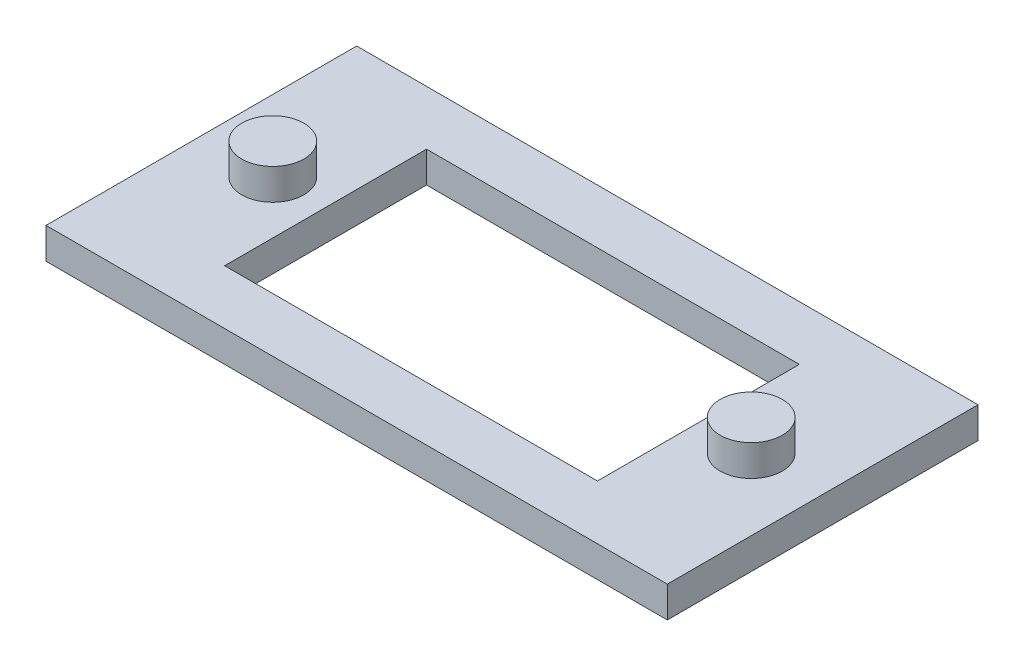
ISO-10303-21;
HEADER;
FILE_DESCRIPTION(('STEP AP214'),'2;1');
FILE_NAME('part.step','',(''),(''),'','','');
FILE_SCHEMA(('AUTOMOTIVE_DESIGN { 1 0 10303 214 1 1 1 1 }'));
ENDSEC;
DATA;
#1=APPLICATION_CONTEXT('core data for automotive mechanical design processes');
#2=APPLICATION_PROTOCOL_DEFINITION('international standard','automotive_design',2000,#1);
#3=PRODUCT_CONTEXT('',#1,'mechanical');
#4=PRODUCT('Part','Part','',(#3));
#5=PRODUCT_RELATED_PRODUCT_CATEGORY('part','',(#4));
#6=PRODUCT_DEFINITION_FORMATION('','',#4);
#7=PRODUCT_DEFINITION_CONTEXT('part definition',#1,'design');
#8=PRODUCT_DEFINITION('design','',#6,#7);
#9=PRODUCT_DEFINITION_SHAPE('','',#8);
#10=(LENGTH_UNIT() NAMED_UNIT(*) SI_UNIT(.MILLI.,.METRE.));
#11=(NAMED_UNIT(*) PLANE_ANGLE_UNIT() SI_UNIT($,.RADIAN.));
#12=(NAMED_UNIT(*) SI_UNIT($,.STERADIAN.) SOLID_ANGLE_UNIT());
#13=UNCERTAINTY_MEASURE_WITH_UNIT(LENGTH_MEASURE(1.E-05),#10,'distance_accuracy_value','');
#14=(GEOMETRIC_REPRESENTATION_CONTEXT(3) GLOBAL_UNCERTAINTY_ASSIGNED_CONTEXT((#13)) GLOBAL_UNIT_ASSIGNED_CONTEXT((#10,
#11,#12)) REPRESENTATION_CONTEXT('',''));
#15=CARTESIAN_POINT('',(0.,0.,0.));
#16=DIRECTION('',(0.,0.,1.));
#17=DIRECTION('',(1.,0.,0.));
#18=AXIS2_PLACEMENT_3D('',#15,#16,#17);
#19=CARTESIAN_POINT('',(10.,1.,5.));
#20=DIRECTION('',(-1.,0.,0.));
#21=DIRECTION('',(0.,0.,1.));
#22=AXIS2_PLACEMENT_3D('',#19,#20,#21);
#23=PLANE('',#22);
#24=DIRECTION('',(0.,0.,-1.));
#25=VECTOR('',#24,1.);
#26=CARTESIAN_POINT('',(10.,0.,5.));
#27=LINE('',#26,#25);
#28=CARTESIAN_POINT('',(10.,0.,5.));
#29=VERTEX_POINT('',#28);
#30=CARTESIAN_POINT('',(10.,0.,-5.));
#31=VERTEX_POINT('',#30);
#32=EDGE_CURVE('E123',#29,#31,#27,.T.);
#33=ORIENTED_EDGE('',*,*,#32,.T.);
#34=DIRECTION('',(0.,-1.,0.));
#35=VECTOR('',#34,1.);
#36=CARTESIAN_POINT('',(10.,1.,-5.));
#37=LINE('',#36,#35);
#38=CARTESIAN_POINT('',(10.,1.,-5.));
#39=VERTEX_POINT('',#38);
#40=EDGE_CURVE('E152',#39,#31,#37,.T.);
#41=ORIENTED_EDGE('',*,*,#40,.F.);
#42=DIRECTION('',(0.,0.,-1.));
#43=VECTOR('',#42,1.);
#44=CARTESIAN_POINT('',(10.,1.,5.));
#45=LINE('',#44,#43);
#46=CARTESIAN_POINT('',(10.,1.,5.));
#47=VERTEX_POINT('',#46);
#48=EDGE_CURVE('E126',#47,#39,#45,.T.);
#49=ORIENTED_EDGE('',*,*,#48,.F.);
#50=DIRECTION('',(0.,-1.,0.));
#51=VECTOR('',#50,1.);
#52=CARTESIAN_POINT('',(10.,1.,5.));
#53=LINE('',#52,#51);
#54=EDGE_CURVE('E136',#47,#29,#53,.T.);
#55=ORIENTED_EDGE('',*,*,#54,.T.);
#56=EDGE_LOOP('',(#33,#41,#49,#55));
#57=FACE_BOUND('',#56,.T.);
#58=ADVANCED_FACE('F33',(#57),#23,.F.);
#59=CARTESIAN_POINT('',(-10.,1.,-5.));
#60=DIRECTION('',(0.,0.,1.));
#61=DIRECTION('',(1.,0.,0.));
#62=AXIS2_PLACEMENT_3D('',#59,#60,#61);
#63=PLANE('',#62);
#64=DIRECTION('',(-1.,0.,0.));
#65=VECTOR('',#64,1.);
#66=CARTESIAN_POINT('',(-10.,0.,-5.));
#67=LINE('',#66,#65);
#68=CARTESIAN_POINT('',(-10.,0.,-5.));
#69=VERTEX_POINT('',#68);
#70=EDGE_CURVE('E139',#31,#69,#67,.T.);
#71=ORIENTED_EDGE('',*,*,#70,.T.);
#72=DIRECTION('',(0.,-1.,0.));
#73=VECTOR('',#72,1.);
#74=CARTESIAN_POINT('',(-10.,1.,-5.));
#75=LINE('',#74,#73);
#76=CARTESIAN_POINT('',(-10.,1.,-5.));
#77=VERTEX_POINT('',#76);
#78=EDGE_CURVE('E149',#77,#69,#75,.T.);
#79=ORIENTED_EDGE('',*,*,#78,.F.);
#80=DIRECTION('',(-1.,0.,0.));
#81=VECTOR('',#80,1.);
#82=CARTESIAN_POINT('',(-10.,1.,-5.));
#83=LINE('',#82,#81);
#84=EDGE_CURVE('E129',#39,#77,#83,.T.);
#85=ORIENTED_EDGE('',*,*,#84,.F.);
#86=ORIENTED_EDGE('',*,*,#40,.T.);
#87=EDGE_LOOP('',(#71,#79,#85,#86));
#88=FACE_BOUND('',#87,.T.);
#89=ADVANCED_FACE('F184',(#88),#63,.F.);
#90=CARTESIAN_POINT('',(-10.,1.,5.));
#91=DIRECTION('',(1.,0.,0.));
#92=DIRECTION('',(0.,0.,-1.));
#93=AXIS2_PLACEMENT_3D('',#90,#91,#92);
#94=PLANE('',#93);
#95=DIRECTION('',(0.,0.,1.));
#96=VECTOR('',#95,1.);
#97=CARTESIAN_POINT('',(-10.,0.,5.));
#98=LINE('',#97,#96);
#99=CARTESIAN_POINT('',(-10.,0.,5.));
#100=VERTEX_POINT('',#99);
#101=EDGE_CURVE('E141',#69,#100,#98,.T.);
#102=ORIENTED_EDGE('',*,*,#101,.T.);
#103=DIRECTION('',(0.,-1.,0.));
#104=VECTOR('',#103,1.);
#105=CARTESIAN_POINT('',(-10.,1.,5.));
#106=LINE('',#105,#104);
#107=CARTESIAN_POINT('',(-10.,1.,5.));
#108=VERTEX_POINT('',#107);
#109=EDGE_CURVE('E146',#108,#100,#106,.T.);
#110=ORIENTED_EDGE('',*,*,#109,.F.);
#111=DIRECTION('',(0.,0.,1.));
#112=VECTOR('',#111,1.);
#113=CARTESIAN_POINT('',(-10.,1.,5.));
#114=LINE('',#113,#112);
#115=EDGE_CURVE('E132',#77,#108,#114,.T.);
#116=ORIENTED_EDGE('',*,*,#115,.F.);
#117=ORIENTED_EDGE('',*,*,#78,.T.);
#118=EDGE_LOOP('',(#102,#110,#116,#117));
#119=FACE_BOUND('',#118,.T.);
#120=ADVANCED_FACE('F178',(#119),#94,.F.);
#121=CARTESIAN_POINT('',(-10.,1.,5.));
#122=DIRECTION('',(0.,0.,-1.));
#123=DIRECTION('',(-1.,0.,0.));
#124=AXIS2_PLACEMENT_3D('',#121,#122,#123);
#125=PLANE('',#124);
#126=DIRECTION('',(1.,0.,0.));
#127=VECTOR('',#126,1.);
#128=CARTESIAN_POINT('',(-10.,0.,5.));
#129=LINE('',#128,#127);
#130=EDGE_CURVE('E130',#100,#29,#129,.T.);
#131=ORIENTED_EDGE('',*,*,#130,.T.);
#132=ORIENTED_EDGE('',*,*,#54,.F.);
#133=DIRECTION('',(1.,0.,0.));
#134=VECTOR('',#133,1.);
#135=CARTESIAN_POINT('',(-10.,1.,5.));
#136=LINE('',#135,#134);
#137=EDGE_CURVE('E134',#108,#47,#136,.T.);
#138=ORIENTED_EDGE('',*,*,#137,.F.);
#139=ORIENTED_EDGE('',*,*,#109,.T.);
#140=EDGE_LOOP('',(#131,#132,#138,#139));
#141=FACE_BOUND('',#140,.T.);
#142=ADVANCED_FACE('F168',(#141),#125,.F.);
#143=CARTESIAN_POINT('',(0.,1.,0.));
#144=DIRECTION('',(0.,-1.,0.));
#145=DIRECTION('',(0.,0.,-1.));
#146=AXIS2_PLACEMENT_3D('',#143,#144,#145);
#147=PLANE('',#146);
#148=CARTESIAN_POINT('',(7.7,1.,0.));
#149=DIRECTION('',(0.,-1.,0.));
#150=DIRECTION('',(0.,0.,-1.));
#151=AXIS2_PLACEMENT_3D('',#148,#149,#150);
#152=CIRCLE('',#151,1.);
#153=CARTESIAN_POINT('',(7.7,1.,-1.));
#154=VERTEX_POINT('',#153);
#155=EDGE_CURVE('E11',#154,#154,#152,.F.);
#156=ORIENTED_EDGE('',*,*,#155,.F.);
#157=EDGE_LOOP('',(#156));
#158=FACE_BOUND('',#157,.T.);
#159=CARTESIAN_POINT('',(-7.7,1.,0.));
#160=DIRECTION('',(0.,-1.,0.));
#161=DIRECTION('',(0.,0.,-1.));
#162=AXIS2_PLACEMENT_3D('',#159,#160,#161);
#163=CIRCLE('',#162,1.);
#164=CARTESIAN_POINT('',(-7.7,1.,-1.));
#165=VERTEX_POINT('',#164);
#166=EDGE_CURVE('E40',#165,#165,#163,.F.);
#167=ORIENTED_EDGE('',*,*,#166,.F.);
#168=EDGE_LOOP('',(#167));
#169=FACE_BOUND('',#168,.T.);
#170=DIRECTION('',(-1.,0.,0.));
#171=VECTOR('',#170,1.);
#172=CARTESIAN_POINT('',(-6.,1.,-3.25));
#173=LINE('',#172,#171);
#174=CARTESIAN_POINT('',(6.,1.,-3.25));
#175=VERTEX_POINT('',#174);
#176=CARTESIAN_POINT('',(-6.,1.,-3.25));
#177=VERTEX_POINT('',#176);
#178=EDGE_CURVE('E109',#175,#177,#173,.T.);
#179=ORIENTED_EDGE('',*,*,#178,.F.);
#180=DIRECTION('',(0.,0.,-1.));
#181=VECTOR('',#180,1.);
#182=CARTESIAN_POINT('',(6.,1.,3.25));
#183=LINE('',#182,#181);
#184=CARTESIAN_POINT('',(6.,1.,3.25));
#185=VERTEX_POINT('',#184);
#186=EDGE_CURVE('E47',#185,#175,#183,.T.);
#187=ORIENTED_EDGE('',*,*,#186,.F.);
#188=DIRECTION('',(1.,0.,0.));
#189=VECTOR('',#188,1.);
#190=CARTESIAN_POINT('',(-6.,1.,3.25));
#191=LINE('',#190,#189);
#192=CARTESIAN_POINT('',(-6.,1.,3.25));
#193=VERTEX_POINT('',#192);
#194=EDGE_CURVE('E116',#193,#185,#191,.T.);
#195=ORIENTED_EDGE('',*,*,#194,.F.);
#196=DIRECTION('',(0.,0.,1.));
#197=VECTOR('',#196,1.);
#198=CARTESIAN_POINT('',(-6.,1.,3.25));
#199=LINE('',#198,#197);
#200=EDGE_CURVE('E100',#177,#193,#199,.T.);
#201=ORIENTED_EDGE('',*,*,#200,.F.);
#202=EDGE_LOOP('',(#179,#187,#195,#201));
#203=FACE_BOUND('',#202,.T.);
#204=ORIENTED_EDGE('',*,*,#48,.T.);
#205=ORIENTED_EDGE('',*,*,#84,.T.);
#206=ORIENTED_EDGE('',*,*,#115,.T.);
#207=ORIENTED_EDGE('',*,*,#137,.T.);
#208=EDGE_LOOP('',(#204,#205,#206,#207));
#209=FACE_BOUND('',#208,.T.);
#210=ADVANCED_FACE('F113',(#158,#169,#203,#209),#147,.F.);
#211=CARTESIAN_POINT('',(0.,0.,0.));
#212=DIRECTION('',(0.,-1.,0.));
#213=DIRECTION('',(0.,0.,-1.));
#214=AXIS2_PLACEMENT_3D('',#211,#212,#213);
#215=PLANE('',#214);
#216=DIRECTION('',(0.,0.,1.));
#217=VECTOR('',#216,1.);
#218=CARTESIAN_POINT('',(6.,0.,0.));
#219=LINE('',#218,#217);
#220=CARTESIAN_POINT('',(6.,0.,-3.25));
#221=VERTEX_POINT('',#220);
#222=CARTESIAN_POINT('',(6.,0.,3.25));
#223=VERTEX_POINT('',#222);
#224=EDGE_CURVE('E160',#221,#223,#219,.T.);
#225=ORIENTED_EDGE('',*,*,#224,.F.);
#226=DIRECTION('',(1.,0.,0.));
#227=VECTOR('',#226,1.);
#228=CARTESIAN_POINT('',(0.,0.,-3.25));
#229=LINE('',#228,#227);
#230=CARTESIAN_POINT('',(-6.,0.,-3.25));
#231=VERTEX_POINT('',#230);
#232=EDGE_CURVE('E155',#231,#221,#229,.T.);
#233=ORIENTED_EDGE('',*,*,#232,.F.);
#234=DIRECTION('',(0.,0.,-1.));
#235=VECTOR('',#234,1.);
#236=CARTESIAN_POINT('',(-6.,0.,0.));
#237=LINE('',#236,#235);
#238=CARTESIAN_POINT('',(-6.,0.,3.25));
#239=VERTEX_POINT('',#238);
#240=EDGE_CURVE('E103',#239,#231,#237,.T.);
#241=ORIENTED_EDGE('',*,*,#240,.F.);
#242=DIRECTION('',(-1.,0.,0.));
#243=VECTOR('',#242,1.);
#244=CARTESIAN_POINT('',(0.,0.,3.25));
#245=LINE('',#244,#243);
#246=EDGE_CURVE('E158',#223,#239,#245,.T.);
#247=ORIENTED_EDGE('',*,*,#246,.F.);
#248=EDGE_LOOP('',(#225,#233,#241,#247));
#249=FACE_BOUND('',#248,.T.);
#250=ORIENTED_EDGE('',*,*,#32,.F.);
#251=ORIENTED_EDGE('',*,*,#130,.F.);
#252=ORIENTED_EDGE('',*,*,#101,.F.);
#253=ORIENTED_EDGE('',*,*,#70,.F.);
#254=EDGE_LOOP('',(#250,#251,#252,#253));
#255=FACE_BOUND('',#254,.T.);
#256=ADVANCED_FACE('F167',(#249,#255),#215,.T.);
#257=CARTESIAN_POINT('',(6.,-3.,3.25));
#258=DIRECTION('',(1.,0.,0.));
#259=DIRECTION('',(0.,0.,-1.));
#260=AXIS2_PLACEMENT_3D('',#257,#258,#259);
#261=PLANE('',#260);
#262=ORIENTED_EDGE('',*,*,#224,.T.);
#263=DIRECTION('',(0.,1.,0.));
#264=VECTOR('',#263,1.);
#265=CARTESIAN_POINT('',(6.,-3.,3.25));
#266=LINE('',#265,#264);
#267=EDGE_CURVE('E121',#223,#185,#266,.T.);
#268=ORIENTED_EDGE('',*,*,#267,.T.);
#269=ORIENTED_EDGE('',*,*,#186,.T.);
#270=DIRECTION('',(0.,1.,0.));
#271=VECTOR('',#270,1.);
#272=CARTESIAN_POINT('',(6.,-3.,-3.25));
#273=LINE('',#272,#271);
#274=EDGE_CURVE('E106',#221,#175,#273,.T.);
#275=ORIENTED_EDGE('',*,*,#274,.F.);
#276=EDGE_LOOP('',(#262,#268,#269,#275));
#277=FACE_BOUND('',#276,.T.);
#278=ADVANCED_FACE('F175',(#277),#261,.F.);
#279=CARTESIAN_POINT('',(-6.,-3.,3.25));
#280=DIRECTION('',(0.,0.,1.));
#281=DIRECTION('',(1.,0.,0.));
#282=AXIS2_PLACEMENT_3D('',#279,#280,#281);
#283=PLANE('',#282);
#284=ORIENTED_EDGE('',*,*,#246,.T.);
#285=DIRECTION('',(0.,1.,0.));
#286=VECTOR('',#285,1.);
#287=CARTESIAN_POINT('',(-6.,-3.,3.25));
#288=LINE('',#287,#286);
#289=EDGE_CURVE('E105',#239,#193,#288,.T.);
#290=ORIENTED_EDGE('',*,*,#289,.T.);
#291=ORIENTED_EDGE('',*,*,#194,.T.);
#292=ORIENTED_EDGE('',*,*,#267,.F.);
#293=EDGE_LOOP('',(#284,#290,#291,#292));
#294=FACE_BOUND('',#293,.T.);
#295=ADVANCED_FACE('F228',(#294),#283,.F.);
#296=CARTESIAN_POINT('',(-6.,-3.,3.25));
#297=DIRECTION('',(-1.,0.,0.));
#298=DIRECTION('',(0.,0.,1.));
#299=AXIS2_PLACEMENT_3D('',#296,#297,#298);
#300=PLANE('',#299);
#301=ORIENTED_EDGE('',*,*,#240,.T.);
#302=DIRECTION('',(0.,1.,0.));
#303=VECTOR('',#302,1.);
#304=CARTESIAN_POINT('',(-6.,-3.,-3.25));
#305=LINE('',#304,#303);
#306=EDGE_CURVE('E55',#231,#177,#305,.T.);
#307=ORIENTED_EDGE('',*,*,#306,.T.);
#308=ORIENTED_EDGE('',*,*,#200,.T.);
#309=ORIENTED_EDGE('',*,*,#289,.F.);
#310=EDGE_LOOP('',(#301,#307,#308,#309));
#311=FACE_BOUND('',#310,.T.);
#312=ADVANCED_FACE('F97',(#311),#300,.F.);
#313=CARTESIAN_POINT('',(-6.,-3.,-3.25));
#314=DIRECTION('',(0.,0.,-1.));
#315=DIRECTION('',(-1.,0.,0.));
#316=AXIS2_PLACEMENT_3D('',#313,#314,#315);
#317=PLANE('',#316);
#318=ORIENTED_EDGE('',*,*,#232,.T.);
#319=ORIENTED_EDGE('',*,*,#274,.T.);
#320=ORIENTED_EDGE('',*,*,#178,.T.);
#321=ORIENTED_EDGE('',*,*,#306,.F.);
#322=EDGE_LOOP('',(#318,#319,#320,#321));
#323=FACE_BOUND('',#322,.T.);
#324=ADVANCED_FACE('F110',(#323),#317,.F.);
#325=CARTESIAN_POINT('',(-7.7,2.,0.));
#326=DIRECTION('',(0.,-1.,0.));
#327=DIRECTION('',(0.,0.,-1.));
#328=AXIS2_PLACEMENT_3D('',#325,#326,#327);
#329=CYLINDRICAL_SURFACE('',#328,1.);
#330=CARTESIAN_POINT('',(-7.7,2.,0.));
#331=DIRECTION('',(0.,1.,0.));
#332=DIRECTION('',(0.,0.,1.));
#333=AXIS2_PLACEMENT_3D('',#330,#331,#332);
#334=CIRCLE('',#333,1.);
#335=CARTESIAN_POINT('',(-7.7,2.,1.));
#336=VERTEX_POINT('',#335);
#337=EDGE_CURVE('E301',#336,#336,#334,.T.);
#338=ORIENTED_EDGE('',*,*,#337,.F.);
#339=EDGE_LOOP('',(#338));
#340=FACE_BOUND('',#339,.T.);
#341=ORIENTED_EDGE('',*,*,#166,.T.);
#342=EDGE_LOOP('',(#341));
#343=FACE_BOUND('',#342,.T.);
#344=ADVANCED_FACE('F164',(#340,#343),#329,.T.);
#345=CARTESIAN_POINT('',(-7.7,2.,0.));
#346=DIRECTION('',(0.,1.,0.));
#347=DIRECTION('',(0.,0.,1.));
#348=AXIS2_PLACEMENT_3D('',#345,#346,#347);
#349=PLANE('',#348);
#350=ORIENTED_EDGE('',*,*,#337,.T.);
#351=EDGE_LOOP('',(#350));
#352=FACE_BOUND('',#351,.T.);
#353=ADVANCED_FACE('F264',(#352),#349,.T.);
#354=CARTESIAN_POINT('',(7.7,2.,0.));
#355=DIRECTION('',(0.,-1.,0.));
#356=DIRECTION('',(0.,0.,-1.));
#357=AXIS2_PLACEMENT_3D('',#354,#355,#356);
#358=CYLINDRICAL_SURFACE('',#357,1.);
#359=CARTESIAN_POINT('',(7.7,2.,0.));
#360=DIRECTION('',(0.,1.,0.));
#361=DIRECTION('',(0.,0.,-1.));
#362=AXIS2_PLACEMENT_3D('',#359,#360,#361);
#363=CIRCLE('',#362,1.);
#364=CARTESIAN_POINT('',(7.7,2.,-1.));
#365=VERTEX_POINT('',#364);
#366=EDGE_CURVE('E300',#365,#365,#363,.T.);
#367=ORIENTED_EDGE('',*,*,#366,.F.);
#368=EDGE_LOOP('',(#367));
#369=FACE_BOUND('',#368,.T.);
#370=ORIENTED_EDGE('',*,*,#155,.T.);
#371=EDGE_LOOP('',(#370));
#372=FACE_BOUND('',#371,.T.);
#373=ADVANCED_FACE('F274',(#369,#372),#358,.T.);
#374=CARTESIAN_POINT('',(7.7,2.,0.));
#375=DIRECTION('',(0.,-1.,0.));
#376=DIRECTION('',(0.,0.,-1.));
#377=AXIS2_PLACEMENT_3D('',#374,#375,#376);
#378=PLANE('',#377);
#379=ORIENTED_EDGE('',*,*,#366,.T.);
#380=EDGE_LOOP('',(#379));
#381=FACE_BOUND('',#380,.T.);
#382=ADVANCED_FACE('F284',(#381),#378,.F.);
#383=CLOSED_SHELL('',(#58,#89,#120,#142,#210,#256,#278,#295,#312,#324,#344,#353,#373,#382));
#384=MANIFOLD_SOLID_BREP('B2',#383);
#385=ADVANCED_BREP_SHAPE_REPRESENTATION('',(#18,#384),#14);
#386=SHAPE_DEFINITION_REPRESENTATION(#9,#385);
ENDSEC;
END-ISO-10303-21;
